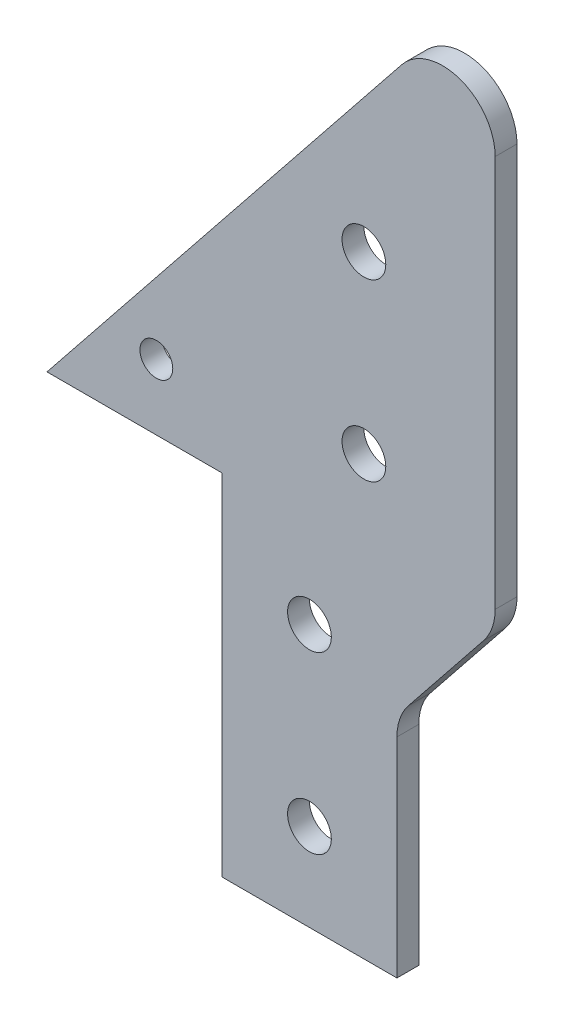
ISO-10303-21;
HEADER;
FILE_DESCRIPTION(('STEP AP214'),'2;1');
FILE_NAME('part.step','',(''),(''),'','','');
FILE_SCHEMA(('AUTOMOTIVE_DESIGN { 1 0 10303 214 1 1 1 1 }'));
ENDSEC;
DATA;
#1=APPLICATION_CONTEXT('core data for automotive mechanical design processes');
#2=APPLICATION_PROTOCOL_DEFINITION('international standard','automotive_design',2000,#1);
#3=PRODUCT_CONTEXT('',#1,'mechanical');
#4=PRODUCT('Part','Part','',(#3));
#5=PRODUCT_RELATED_PRODUCT_CATEGORY('part','',(#4));
#6=PRODUCT_DEFINITION_FORMATION('','',#4);
#7=PRODUCT_DEFINITION_CONTEXT('part definition',#1,'design');
#8=PRODUCT_DEFINITION('design','',#6,#7);
#9=PRODUCT_DEFINITION_SHAPE('','',#8);
#10=(LENGTH_UNIT() NAMED_UNIT(*) SI_UNIT(.MILLI.,.METRE.));
#11=(NAMED_UNIT(*) PLANE_ANGLE_UNIT() SI_UNIT($,.RADIAN.));
#12=(NAMED_UNIT(*) SI_UNIT($,.STERADIAN.) SOLID_ANGLE_UNIT());
#13=UNCERTAINTY_MEASURE_WITH_UNIT(LENGTH_MEASURE(1.E-05),#10,'distance_accuracy_value','');
#14=(GEOMETRIC_REPRESENTATION_CONTEXT(3) GLOBAL_UNCERTAINTY_ASSIGNED_CONTEXT((#13)) GLOBAL_UNIT_ASSIGNED_CONTEXT((#10,
#11,#12)) REPRESENTATION_CONTEXT('',''));
#15=CARTESIAN_POINT('',(0.,0.,0.));
#16=DIRECTION('',(0.,0.,1.));
#17=DIRECTION('',(1.,0.,0.));
#18=AXIS2_PLACEMENT_3D('',#15,#16,#17);
#19=CARTESIAN_POINT('',(0.,0.,3.175));
#20=DIRECTION('',(0.,-1.,0.));
#21=DIRECTION('',(1.,0.,0.));
#22=AXIS2_PLACEMENT_3D('',#19,#20,#21);
#23=PLANE('',#22);
#24=DIRECTION('',(-1.,0.,0.));
#25=VECTOR('',#24,1.);
#26=CARTESIAN_POINT('',(0.,0.,0.));
#27=LINE('',#26,#25);
#28=CARTESIAN_POINT('',(25.4,0.,0.));
#29=VERTEX_POINT('',#28);
#30=CARTESIAN_POINT('',(0.,0.,0.));
#31=VERTEX_POINT('',#30);
#32=EDGE_CURVE('E121',#29,#31,#27,.T.);
#33=ORIENTED_EDGE('',*,*,#32,.F.);
#34=DIRECTION('',(0.,0.,-1.));
#35=VECTOR('',#34,1.);
#36=CARTESIAN_POINT('',(25.4,0.,3.175));
#37=LINE('',#36,#35);
#38=CARTESIAN_POINT('',(25.4,0.,3.175));
#39=VERTEX_POINT('',#38);
#40=EDGE_CURVE('E117',#39,#29,#37,.T.);
#41=ORIENTED_EDGE('',*,*,#40,.F.);
#42=DIRECTION('',(-1.,0.,0.));
#43=VECTOR('',#42,1.);
#44=CARTESIAN_POINT('',(0.,0.,3.175));
#45=LINE('',#44,#43);
#46=CARTESIAN_POINT('',(0.,0.,3.175));
#47=VERTEX_POINT('',#46);
#48=EDGE_CURVE('E119',#39,#47,#45,.T.);
#49=ORIENTED_EDGE('',*,*,#48,.T.);
#50=DIRECTION('',(0.,0.,-1.));
#51=VECTOR('',#50,1.);
#52=CARTESIAN_POINT('',(0.,0.,3.175));
#53=LINE('',#52,#51);
#54=EDGE_CURVE('E163',#47,#31,#53,.T.);
#55=ORIENTED_EDGE('',*,*,#54,.T.);
#56=EDGE_LOOP('',(#33,#41,#49,#55));
#57=FACE_BOUND('',#56,.T.);
#58=ADVANCED_FACE('F38',(#57),#23,.T.);
#59=CARTESIAN_POINT('',(25.4,0.,3.175));
#60=DIRECTION('',(-1.,0.,0.));
#61=DIRECTION('',(0.,0.,1.));
#62=AXIS2_PLACEMENT_3D('',#59,#60,#61);
#63=PLANE('',#62);
#64=DIRECTION('',(0.,1.,0.));
#65=VECTOR('',#64,1.);
#66=CARTESIAN_POINT('',(25.4,0.,0.));
#67=LINE('',#66,#65);
#68=CARTESIAN_POINT('',(25.4,-50.8,0.));
#69=VERTEX_POINT('',#68);
#70=EDGE_CURVE('E171',#69,#29,#67,.T.);
#71=ORIENTED_EDGE('',*,*,#70,.F.);
#72=DIRECTION('',(0.,0.,-1.));
#73=VECTOR('',#72,1.);
#74=CARTESIAN_POINT('',(25.4,-50.8,3.175));
#75=LINE('',#74,#73);
#76=CARTESIAN_POINT('',(25.4,-50.8,3.175));
#77=VERTEX_POINT('',#76);
#78=EDGE_CURVE('E127',#77,#69,#75,.T.);
#79=ORIENTED_EDGE('',*,*,#78,.F.);
#80=DIRECTION('',(0.,1.,0.));
#81=VECTOR('',#80,1.);
#82=CARTESIAN_POINT('',(25.4,0.,3.175));
#83=LINE('',#82,#81);
#84=EDGE_CURVE('E134',#77,#39,#83,.T.);
#85=ORIENTED_EDGE('',*,*,#84,.T.);
#86=ORIENTED_EDGE('',*,*,#40,.T.);
#87=EDGE_LOOP('',(#71,#79,#85,#86));
#88=FACE_BOUND('',#87,.T.);
#89=ADVANCED_FACE('F138',(#88),#63,.T.);
#90=CARTESIAN_POINT('',(0.,-50.8,3.175));
#91=DIRECTION('',(0.,1.,0.));
#92=DIRECTION('',(0.,0.,1.));
#93=AXIS2_PLACEMENT_3D('',#90,#91,#92);
#94=PLANE('',#93);
#95=DIRECTION('',(1.,0.,0.));
#96=VECTOR('',#95,1.);
#97=CARTESIAN_POINT('',(0.,-50.8,0.));
#98=LINE('',#97,#96);
#99=CARTESIAN_POINT('',(50.8,-50.8,0.));
#100=VERTEX_POINT('',#99);
#101=EDGE_CURVE('E173',#69,#100,#98,.T.);
#102=ORIENTED_EDGE('',*,*,#101,.T.);
#103=DIRECTION('',(0.,0.,-1.));
#104=VECTOR('',#103,1.);
#105=CARTESIAN_POINT('',(50.8,-50.8,3.175));
#106=LINE('',#105,#104);
#107=CARTESIAN_POINT('',(50.8,-50.8,3.175));
#108=VERTEX_POINT('',#107);
#109=EDGE_CURVE('E199',#108,#100,#106,.T.);
#110=ORIENTED_EDGE('',*,*,#109,.F.);
#111=DIRECTION('',(1.,0.,0.));
#112=VECTOR('',#111,1.);
#113=CARTESIAN_POINT('',(0.,-50.8,3.175));
#114=LINE('',#113,#112);
#115=EDGE_CURVE('E140',#77,#108,#114,.T.);
#116=ORIENTED_EDGE('',*,*,#115,.F.);
#117=ORIENTED_EDGE('',*,*,#78,.T.);
#118=EDGE_LOOP('',(#102,#110,#116,#117));
#119=FACE_BOUND('',#118,.T.);
#120=ADVANCED_FACE('F249',(#119),#94,.F.);
#121=CARTESIAN_POINT('',(50.8,0.,3.175));
#122=DIRECTION('',(-1.,0.,0.));
#123=DIRECTION('',(0.,0.,1.));
#124=AXIS2_PLACEMENT_3D('',#121,#122,#123);
#125=PLANE('',#124);
#126=DIRECTION('',(0.,1.,0.));
#127=VECTOR('',#126,1.);
#128=CARTESIAN_POINT('',(50.8,0.,0.));
#129=LINE('',#128,#127);
#130=CARTESIAN_POINT('',(50.8,-20.4926294877068,0.));
#131=VERTEX_POINT('',#130);
#132=EDGE_CURVE('E176',#100,#131,#129,.T.);
#133=ORIENTED_EDGE('',*,*,#132,.T.);
#134=DIRECTION('',(0.,0.,-1.));
#135=VECTOR('',#134,1.);
#136=CARTESIAN_POINT('',(50.8,-20.4926294877068,3.175));
#137=LINE('',#136,#135);
#138=CARTESIAN_POINT('',(50.8,-20.4926294877068,3.175));
#139=VERTEX_POINT('',#138);
#140=EDGE_CURVE('E207',#131,#139,#137,.F.);
#141=ORIENTED_EDGE('',*,*,#140,.T.);
#142=DIRECTION('',(0.,1.,0.));
#143=VECTOR('',#142,1.);
#144=CARTESIAN_POINT('',(50.8,0.,3.175));
#145=LINE('',#144,#143);
#146=EDGE_CURVE('E142',#108,#139,#145,.T.);
#147=ORIENTED_EDGE('',*,*,#146,.F.);
#148=ORIENTED_EDGE('',*,*,#109,.T.);
#149=EDGE_LOOP('',(#133,#141,#147,#148));
#150=FACE_BOUND('',#149,.T.);
#151=ADVANCED_FACE('F231',(#150),#125,.F.);
#152=CARTESIAN_POINT('',(39.668135519706,-31.7345084157648,3.175));
#153=DIRECTION('',(0.78086880944303,-0.624695047554424,0.));
#154=DIRECTION('',(0.624695047554424,0.780868809443031,0.));
#155=AXIS2_PLACEMENT_3D('',#152,#153,#154);
#156=PLANE('',#155);
#157=DIRECTION('',(-0.624695047554424,-0.78086880944303,0.));
#158=VECTOR('',#157,1.);
#159=CARTESIAN_POINT('',(39.668135519706,-31.7345084157648,3.175));
#160=LINE('',#159,#158);
#161=CARTESIAN_POINT('',(63.3859625802737,-2.08722459005512,3.175));
#162=VERTEX_POINT('',#161);
#163=CARTESIAN_POINT('',(52.4697796720441,-15.7324532253421,3.175));
#164=VERTEX_POINT('',#163);
#165=EDGE_CURVE('E148',#162,#164,#160,.T.);
#166=ORIENTED_EDGE('',*,*,#165,.T.);
#167=DIRECTION('',(0.,0.,-1.));
#168=VECTOR('',#167,1.);
#169=CARTESIAN_POINT('',(52.4697796720441,-15.7324532253421,3.175));
#170=LINE('',#169,#168);
#171=CARTESIAN_POINT('',(52.4697796720441,-15.7324532253421,0.));
#172=VERTEX_POINT('',#171);
#173=EDGE_CURVE('E204',#164,#172,#170,.T.);
#174=ORIENTED_EDGE('',*,*,#173,.T.);
#175=DIRECTION('',(-0.624695047554424,-0.78086880944303,0.));
#176=VECTOR('',#175,1.);
#177=CARTESIAN_POINT('',(39.668135519706,-31.7345084157648,0.));
#178=LINE('',#177,#176);
#179=CARTESIAN_POINT('',(63.3859625802737,-2.08722459005512,0.));
#180=VERTEX_POINT('',#179);
#181=EDGE_CURVE('E179',#180,#172,#178,.T.);
#182=ORIENTED_EDGE('',*,*,#181,.F.);
#183=DIRECTION('',(0.,0.,-1.));
#184=VECTOR('',#183,1.);
#185=CARTESIAN_POINT('',(63.3859625802737,-2.08722459005513,3.175));
#186=LINE('',#185,#184);
#187=EDGE_CURVE('E126',#180,#162,#186,.F.);
#188=ORIENTED_EDGE('',*,*,#187,.T.);
#189=EDGE_LOOP('',(#166,#174,#182,#188));
#190=FACE_BOUND('',#189,.T.);
#191=ADVANCED_FACE('F237',(#190),#156,.T.);
#192=CARTESIAN_POINT('',(65.0557422523178,0.,3.175));
#193=DIRECTION('',(-1.,0.,0.));
#194=DIRECTION('',(0.,0.,1.));
#195=AXIS2_PLACEMENT_3D('',#192,#193,#194);
#196=PLANE('',#195);
#197=DIRECTION('',(0.,1.,0.));
#198=VECTOR('',#197,1.);
#199=CARTESIAN_POINT('',(65.0557422523178,0.,3.175));
#200=LINE('',#199,#198);
#201=CARTESIAN_POINT('',(65.0557422523178,2.67295167230959,3.175));
#202=VERTEX_POINT('',#201);
#203=CARTESIAN_POINT('',(65.0557422523178,59.5967261430877,3.175));
#204=VERTEX_POINT('',#203);
#205=EDGE_CURVE('E151',#202,#204,#200,.T.);
#206=ORIENTED_EDGE('',*,*,#205,.F.);
#207=DIRECTION('',(0.,0.,-1.));
#208=VECTOR('',#207,1.);
#209=CARTESIAN_POINT('',(65.0557422523178,2.67295167230959,0.));
#210=LINE('',#209,#208);
#211=CARTESIAN_POINT('',(65.0557422523178,2.67295167230959,0.));
#212=VERTEX_POINT('',#211);
#213=EDGE_CURVE('E211',#202,#212,#210,.T.);
#214=ORIENTED_EDGE('',*,*,#213,.T.);
#215=DIRECTION('',(0.,1.,0.));
#216=VECTOR('',#215,1.);
#217=CARTESIAN_POINT('',(65.0557422523178,0.,0.));
#218=LINE('',#217,#216);
#219=CARTESIAN_POINT('',(65.0557422523178,59.5967261430877,0.));
#220=VERTEX_POINT('',#219);
#221=EDGE_CURVE('E182',#212,#220,#218,.T.);
#222=ORIENTED_EDGE('',*,*,#221,.T.);
#223=DIRECTION('',(0.,0.,-1.));
#224=VECTOR('',#223,1.);
#225=CARTESIAN_POINT('',(65.0557422523178,59.5967261430877,3.175));
#226=LINE('',#225,#224);
#227=EDGE_CURVE('E209',#220,#204,#226,.F.);
#228=ORIENTED_EDGE('',*,*,#227,.T.);
#229=EDGE_LOOP('',(#206,#214,#222,#228));
#230=FACE_BOUND('',#229,.T.);
#231=ADVANCED_FACE('F244',(#230),#196,.F.);
#232=CARTESIAN_POINT('',(38.1,-12.7,3.175));
#233=DIRECTION('',(0.,0.,-1.));
#234=DIRECTION('',(-1.,0.,0.));
#235=AXIS2_PLACEMENT_3D('',#232,#233,#234);
#236=CYLINDRICAL_SURFACE('',#235,3.175);
#237=CARTESIAN_POINT('',(38.1,-12.7,3.175));
#238=DIRECTION('',(0.,0.,1.));
#239=DIRECTION('',(1.,0.,0.));
#240=AXIS2_PLACEMENT_3D('',#237,#238,#239);
#241=CIRCLE('',#240,3.175);
#242=CARTESIAN_POINT('',(41.275,-12.7,3.175));
#243=VERTEX_POINT('',#242);
#244=EDGE_CURVE('E157',#243,#243,#241,.T.);
#245=ORIENTED_EDGE('',*,*,#244,.T.);
#246=EDGE_LOOP('',(#245));
#247=FACE_BOUND('',#246,.T.);
#248=CARTESIAN_POINT('',(38.1,-12.7,0.));
#249=DIRECTION('',(0.,0.,1.));
#250=DIRECTION('',(1.,0.,0.));
#251=AXIS2_PLACEMENT_3D('',#248,#249,#250);
#252=CIRCLE('',#251,3.175);
#253=CARTESIAN_POINT('',(41.275,-12.7,0.));
#254=VERTEX_POINT('',#253);
#255=EDGE_CURVE('E191',#254,#254,#252,.T.);
#256=ORIENTED_EDGE('',*,*,#255,.F.);
#257=EDGE_LOOP('',(#256));
#258=FACE_BOUND('',#257,.T.);
#259=ADVANCED_FACE('F336',(#247,#258),#236,.F.);
#260=CARTESIAN_POINT('',(15.875,9.525,3.175));
#261=DIRECTION('',(0.,0.,-1.));
#262=DIRECTION('',(-1.,0.,0.));
#263=AXIS2_PLACEMENT_3D('',#260,#261,#262);
#264=CYLINDRICAL_SURFACE('',#263,2.38125);
#265=CARTESIAN_POINT('',(15.875,9.525,3.175));
#266=DIRECTION('',(0.,0.,1.));
#267=DIRECTION('',(1.,0.,0.));
#268=AXIS2_PLACEMENT_3D('',#265,#266,#267);
#269=CIRCLE('',#268,2.38125);
#270=CARTESIAN_POINT('',(18.25625,9.525,3.175));
#271=VERTEX_POINT('',#270);
#272=EDGE_CURVE('E154',#271,#271,#269,.T.);
#273=ORIENTED_EDGE('',*,*,#272,.T.);
#274=EDGE_LOOP('',(#273));
#275=FACE_BOUND('',#274,.T.);
#276=CARTESIAN_POINT('',(15.875,9.525,0.));
#277=DIRECTION('',(0.,0.,1.));
#278=DIRECTION('',(1.,0.,0.));
#279=AXIS2_PLACEMENT_3D('',#276,#277,#278);
#280=CIRCLE('',#279,2.38125);
#281=CARTESIAN_POINT('',(18.25625,9.525,0.));
#282=VERTEX_POINT('',#281);
#283=EDGE_CURVE('E188',#282,#282,#280,.T.);
#284=ORIENTED_EDGE('',*,*,#283,.F.);
#285=EDGE_LOOP('',(#284));
#286=FACE_BOUND('',#285,.T.);
#287=ADVANCED_FACE('F323',(#275,#286),#264,.F.);
#288=CARTESIAN_POINT('',(0.,0.,3.175));
#289=DIRECTION('',(-0.78086880944303,0.624695047554424,0.));
#290=DIRECTION('',(-0.624695047554424,-0.780868809443031,0.));
#291=AXIS2_PLACEMENT_3D('',#288,#289,#290);
#292=PLANE('',#291);
#293=DIRECTION('',(0.624695047554424,0.78086880944303,0.));
#294=VECTOR('',#293,1.);
#295=CARTESIAN_POINT('',(0.,0.,3.175));
#296=LINE('',#295,#294);
#297=CARTESIAN_POINT('',(51.4855219243619,64.3569024054524,3.175));
#298=VERTEX_POINT('',#297);
#299=EDGE_CURVE('E135',#47,#298,#296,.T.);
#300=ORIENTED_EDGE('',*,*,#299,.T.);
#301=DIRECTION('',(0.,0.,-1.));
#302=VECTOR('',#301,1.);
#303=CARTESIAN_POINT('',(51.4855219243619,64.3569024054524,0.));
#304=LINE('',#303,#302);
#305=CARTESIAN_POINT('',(51.4855219243619,64.3569024054524,0.));
#306=VERTEX_POINT('',#305);
#307=EDGE_CURVE('E220',#298,#306,#304,.T.);
#308=ORIENTED_EDGE('',*,*,#307,.T.);
#309=DIRECTION('',(0.624695047554424,0.78086880944303,0.));
#310=VECTOR('',#309,1.);
#311=CARTESIAN_POINT('',(0.,0.,0.));
#312=LINE('',#311,#310);
#313=EDGE_CURVE('E185',#31,#306,#312,.T.);
#314=ORIENTED_EDGE('',*,*,#313,.F.);
#315=ORIENTED_EDGE('',*,*,#54,.F.);
#316=EDGE_LOOP('',(#300,#308,#314,#315));
#317=FACE_BOUND('',#316,.T.);
#318=ADVANCED_FACE('F247',(#317),#292,.T.);
#319=CARTESIAN_POINT('',(46.0057422523178,12.7,3.175));
#320=DIRECTION('',(0.,0.,-1.));
#321=DIRECTION('',(-1.,0.,0.));
#322=AXIS2_PLACEMENT_3D('',#319,#320,#321);
#323=CYLINDRICAL_SURFACE('',#322,3.175);
#324=CARTESIAN_POINT('',(46.0057422523178,12.7,3.175));
#325=DIRECTION('',(0.,0.,1.));
#326=DIRECTION('',(1.,0.,0.));
#327=AXIS2_PLACEMENT_3D('',#324,#325,#326);
#328=CIRCLE('',#327,3.175);
#329=CARTESIAN_POINT('',(49.1807422523178,12.7,3.175));
#330=VERTEX_POINT('',#329);
#331=EDGE_CURVE('E136',#330,#330,#328,.T.);
#332=ORIENTED_EDGE('',*,*,#331,.T.);
#333=EDGE_LOOP('',(#332));
#334=FACE_BOUND('',#333,.T.);
#335=CARTESIAN_POINT('',(46.0057422523178,12.7,0.));
#336=DIRECTION('',(0.,0.,1.));
#337=DIRECTION('',(1.,0.,0.));
#338=AXIS2_PLACEMENT_3D('',#335,#336,#337);
#339=CIRCLE('',#338,3.175);
#340=CARTESIAN_POINT('',(49.1807422523178,12.7,0.));
#341=VERTEX_POINT('',#340);
#342=EDGE_CURVE('E167',#341,#341,#339,.T.);
#343=ORIENTED_EDGE('',*,*,#342,.F.);
#344=EDGE_LOOP('',(#343));
#345=FACE_BOUND('',#344,.T.);
#346=ADVANCED_FACE('F263',(#334,#345),#323,.F.);
#347=CARTESIAN_POINT('',(46.0057422523178,38.1,3.175));
#348=DIRECTION('',(0.,0.,-1.));
#349=DIRECTION('',(-1.,0.,0.));
#350=AXIS2_PLACEMENT_3D('',#347,#348,#349);
#351=CYLINDRICAL_SURFACE('',#350,3.175);
#352=CARTESIAN_POINT('',(46.0057422523178,38.1,3.175));
#353=DIRECTION('',(0.,0.,1.));
#354=DIRECTION('',(1.,0.,0.));
#355=AXIS2_PLACEMENT_3D('',#352,#353,#354);
#356=CIRCLE('',#355,3.175);
#357=CARTESIAN_POINT('',(49.1807422523178,38.1,3.175));
#358=VERTEX_POINT('',#357);
#359=EDGE_CURVE('E197',#358,#358,#356,.T.);
#360=ORIENTED_EDGE('',*,*,#359,.T.);
#361=EDGE_LOOP('',(#360));
#362=FACE_BOUND('',#361,.T.);
#363=CARTESIAN_POINT('',(46.0057422523178,38.1,0.));
#364=DIRECTION('',(0.,0.,1.));
#365=DIRECTION('',(1.,0.,0.));
#366=AXIS2_PLACEMENT_3D('',#363,#364,#365);
#367=CIRCLE('',#366,3.175);
#368=CARTESIAN_POINT('',(49.1807422523178,38.1,0.));
#369=VERTEX_POINT('',#368);
#370=EDGE_CURVE('E164',#369,#369,#367,.T.);
#371=ORIENTED_EDGE('',*,*,#370,.F.);
#372=EDGE_LOOP('',(#371));
#373=FACE_BOUND('',#372,.T.);
#374=ADVANCED_FACE('F266',(#362,#373),#351,.F.);
#375=CARTESIAN_POINT('',(38.1,-38.1,3.175));
#376=DIRECTION('',(0.,0.,-1.));
#377=DIRECTION('',(-1.,0.,0.));
#378=AXIS2_PLACEMENT_3D('',#375,#376,#377);
#379=CYLINDRICAL_SURFACE('',#378,3.175);
#380=CARTESIAN_POINT('',(38.1,-38.1,3.175));
#381=DIRECTION('',(0.,0.,1.));
#382=DIRECTION('',(1.,0.,0.));
#383=AXIS2_PLACEMENT_3D('',#380,#381,#382);
#384=CIRCLE('',#383,3.175);
#385=CARTESIAN_POINT('',(41.275,-38.1,3.175));
#386=VERTEX_POINT('',#385);
#387=EDGE_CURVE('E160',#386,#386,#384,.T.);
#388=ORIENTED_EDGE('',*,*,#387,.T.);
#389=EDGE_LOOP('',(#388));
#390=FACE_BOUND('',#389,.T.);
#391=CARTESIAN_POINT('',(38.1,-38.1,0.));
#392=DIRECTION('',(0.,0.,1.));
#393=DIRECTION('',(1.,0.,0.));
#394=AXIS2_PLACEMENT_3D('',#391,#392,#393);
#395=CIRCLE('',#394,3.175);
#396=CARTESIAN_POINT('',(41.275,-38.1,0.));
#397=VERTEX_POINT('',#396);
#398=EDGE_CURVE('E194',#397,#397,#395,.T.);
#399=ORIENTED_EDGE('',*,*,#398,.F.);
#400=EDGE_LOOP('',(#399));
#401=FACE_BOUND('',#400,.T.);
#402=ADVANCED_FACE('F270',(#390,#401),#379,.F.);
#403=CARTESIAN_POINT('',(0.,0.,3.175));
#404=DIRECTION('',(0.,0.,1.));
#405=DIRECTION('',(1.,0.,0.));
#406=AXIS2_PLACEMENT_3D('',#403,#404,#405);
#407=PLANE('',#406);
#408=ORIENTED_EDGE('',*,*,#359,.F.);
#409=EDGE_LOOP('',(#408));
#410=FACE_BOUND('',#409,.T.);
#411=ORIENTED_EDGE('',*,*,#331,.F.);
#412=EDGE_LOOP('',(#411));
#413=FACE_BOUND('',#412,.T.);
#414=ORIENTED_EDGE('',*,*,#165,.F.);
#415=CARTESIAN_POINT('',(57.4357422523178,2.67295167230959,3.175));
#416=DIRECTION('',(0.,0.,1.));
#417=DIRECTION('',(1.,0.,0.));
#418=AXIS2_PLACEMENT_3D('',#415,#416,#417);
#419=CIRCLE('',#418,7.62);
#420=EDGE_CURVE('E218',#162,#202,#419,.T.);
#421=ORIENTED_EDGE('',*,*,#420,.T.);
#422=ORIENTED_EDGE('',*,*,#205,.T.);
#423=CARTESIAN_POINT('',(57.4357422523178,59.5967261430877,3.175));
#424=DIRECTION('',(0.,0.,1.));
#425=DIRECTION('',(1.,0.,0.));
#426=AXIS2_PLACEMENT_3D('',#423,#424,#425);
#427=CIRCLE('',#426,7.62);
#428=EDGE_CURVE('E53',#204,#298,#427,.T.);
#429=ORIENTED_EDGE('',*,*,#428,.T.);
#430=ORIENTED_EDGE('',*,*,#299,.F.);
#431=ORIENTED_EDGE('',*,*,#48,.F.);
#432=ORIENTED_EDGE('',*,*,#84,.F.);
#433=ORIENTED_EDGE('',*,*,#115,.T.);
#434=ORIENTED_EDGE('',*,*,#146,.T.);
#435=CARTESIAN_POINT('',(58.42,-20.4926294877068,3.175));
#436=DIRECTION('',(0.,0.,1.));
#437=DIRECTION('',(1.,0.,0.));
#438=AXIS2_PLACEMENT_3D('',#435,#436,#437);
#439=CIRCLE('',#438,7.62);
#440=EDGE_CURVE('E11',#139,#164,#439,.F.);
#441=ORIENTED_EDGE('',*,*,#440,.T.);
#442=EDGE_LOOP('',(#414,#421,#422,#429,#430,#431,#432,#433,#434,#441));
#443=FACE_BOUND('',#442,.T.);
#444=ORIENTED_EDGE('',*,*,#272,.F.);
#445=EDGE_LOOP('',(#444));
#446=FACE_BOUND('',#445,.T.);
#447=ORIENTED_EDGE('',*,*,#244,.F.);
#448=EDGE_LOOP('',(#447));
#449=FACE_BOUND('',#448,.T.);
#450=ORIENTED_EDGE('',*,*,#387,.F.);
#451=EDGE_LOOP('',(#450));
#452=FACE_BOUND('',#451,.T.);
#453=ADVANCED_FACE('F131',(#410,#413,#443,#446,#449,#452),#407,.T.);
#454=CARTESIAN_POINT('',(0.,0.,0.));
#455=DIRECTION('',(0.,0.,1.));
#456=DIRECTION('',(1.,0.,0.));
#457=AXIS2_PLACEMENT_3D('',#454,#455,#456);
#458=PLANE('',#457);
#459=ORIENTED_EDGE('',*,*,#370,.T.);
#460=EDGE_LOOP('',(#459));
#461=FACE_BOUND('',#460,.T.);
#462=ORIENTED_EDGE('',*,*,#342,.T.);
#463=EDGE_LOOP('',(#462));
#464=FACE_BOUND('',#463,.T.);
#465=ORIENTED_EDGE('',*,*,#221,.F.);
#466=CARTESIAN_POINT('',(57.4357422523178,2.67295167230959,0.));
#467=DIRECTION('',(0.,0.,1.));
#468=DIRECTION('',(1.,0.,0.));
#469=AXIS2_PLACEMENT_3D('',#466,#467,#468);
#470=CIRCLE('',#469,7.62);
#471=EDGE_CURVE('E215',#212,#180,#470,.F.);
#472=ORIENTED_EDGE('',*,*,#471,.T.);
#473=ORIENTED_EDGE('',*,*,#181,.T.);
#474=CARTESIAN_POINT('',(58.42,-20.4926294877068,0.));
#475=DIRECTION('',(0.,0.,1.));
#476=DIRECTION('',(1.,0.,0.));
#477=AXIS2_PLACEMENT_3D('',#474,#475,#476);
#478=CIRCLE('',#477,7.62);
#479=EDGE_CURVE('E46',#172,#131,#478,.T.);
#480=ORIENTED_EDGE('',*,*,#479,.T.);
#481=ORIENTED_EDGE('',*,*,#132,.F.);
#482=ORIENTED_EDGE('',*,*,#101,.F.);
#483=ORIENTED_EDGE('',*,*,#70,.T.);
#484=ORIENTED_EDGE('',*,*,#32,.T.);
#485=ORIENTED_EDGE('',*,*,#313,.T.);
#486=CARTESIAN_POINT('',(57.4357422523178,59.5967261430877,0.));
#487=DIRECTION('',(0.,0.,1.));
#488=DIRECTION('',(1.,0.,0.));
#489=AXIS2_PLACEMENT_3D('',#486,#487,#488);
#490=CIRCLE('',#489,7.62);
#491=EDGE_CURVE('E61',#306,#220,#490,.F.);
#492=ORIENTED_EDGE('',*,*,#491,.T.);
#493=EDGE_LOOP('',(#465,#472,#473,#480,#481,#482,#483,#484,#485,#492));
#494=FACE_BOUND('',#493,.T.);
#495=ORIENTED_EDGE('',*,*,#283,.T.);
#496=EDGE_LOOP('',(#495));
#497=FACE_BOUND('',#496,.T.);
#498=ORIENTED_EDGE('',*,*,#255,.T.);
#499=EDGE_LOOP('',(#498));
#500=FACE_BOUND('',#499,.T.);
#501=ORIENTED_EDGE('',*,*,#398,.T.);
#502=EDGE_LOOP('',(#501));
#503=FACE_BOUND('',#502,.T.);
#504=ADVANCED_FACE('F223',(#461,#464,#494,#497,#500,#503),#458,.F.);
#505=CARTESIAN_POINT('',(58.42,-20.4926294877068,3.175));
#506=DIRECTION('',(0.,0.,-1.));
#507=DIRECTION('',(-1.,0.,0.));
#508=AXIS2_PLACEMENT_3D('',#505,#506,#507);
#509=CYLINDRICAL_SURFACE('',#508,7.62);
#510=ORIENTED_EDGE('',*,*,#440,.F.);
#511=ORIENTED_EDGE('',*,*,#140,.F.);
#512=ORIENTED_EDGE('',*,*,#479,.F.);
#513=ORIENTED_EDGE('',*,*,#173,.F.);
#514=EDGE_LOOP('',(#510,#511,#512,#513));
#515=FACE_BOUND('',#514,.T.);
#516=ADVANCED_FACE('F234',(#515),#509,.F.);
#517=CARTESIAN_POINT('',(57.4357422523178,2.67295167230959,3.175));
#518=DIRECTION('',(0.,0.,1.));
#519=DIRECTION('',(1.,0.,0.));
#520=AXIS2_PLACEMENT_3D('',#517,#518,#519);
#521=CYLINDRICAL_SURFACE('',#520,7.62);
#522=ORIENTED_EDGE('',*,*,#420,.F.);
#523=ORIENTED_EDGE('',*,*,#187,.F.);
#524=ORIENTED_EDGE('',*,*,#471,.F.);
#525=ORIENTED_EDGE('',*,*,#213,.F.);
#526=EDGE_LOOP('',(#522,#523,#524,#525));
#527=FACE_BOUND('',#526,.T.);
#528=ADVANCED_FACE('F240',(#527),#521,.T.);
#529=CARTESIAN_POINT('',(57.4357422523178,59.5967261430877,3.175));
#530=DIRECTION('',(0.,0.,1.));
#531=DIRECTION('',(1.,0.,0.));
#532=AXIS2_PLACEMENT_3D('',#529,#530,#531);
#533=CYLINDRICAL_SURFACE('',#532,7.62);
#534=ORIENTED_EDGE('',*,*,#428,.F.);
#535=ORIENTED_EDGE('',*,*,#227,.F.);
#536=ORIENTED_EDGE('',*,*,#491,.F.);
#537=ORIENTED_EDGE('',*,*,#307,.F.);
#538=EDGE_LOOP('',(#534,#535,#536,#537));
#539=FACE_BOUND('',#538,.T.);
#540=ADVANCED_FACE('F40',(#539),#533,.T.);
#541=CLOSED_SHELL('',(#58,#89,#120,#151,#191,#231,#259,#287,#318,#346,#374,#402,#453,#504,#516,
#528,#540));
#542=MANIFOLD_SOLID_BREP('B2',#541);
#543=ADVANCED_BREP_SHAPE_REPRESENTATION('',(#18,#542),#14);
#544=SHAPE_DEFINITION_REPRESENTATION(#9,#543);
ENDSEC;
END-ISO-10303-21;
